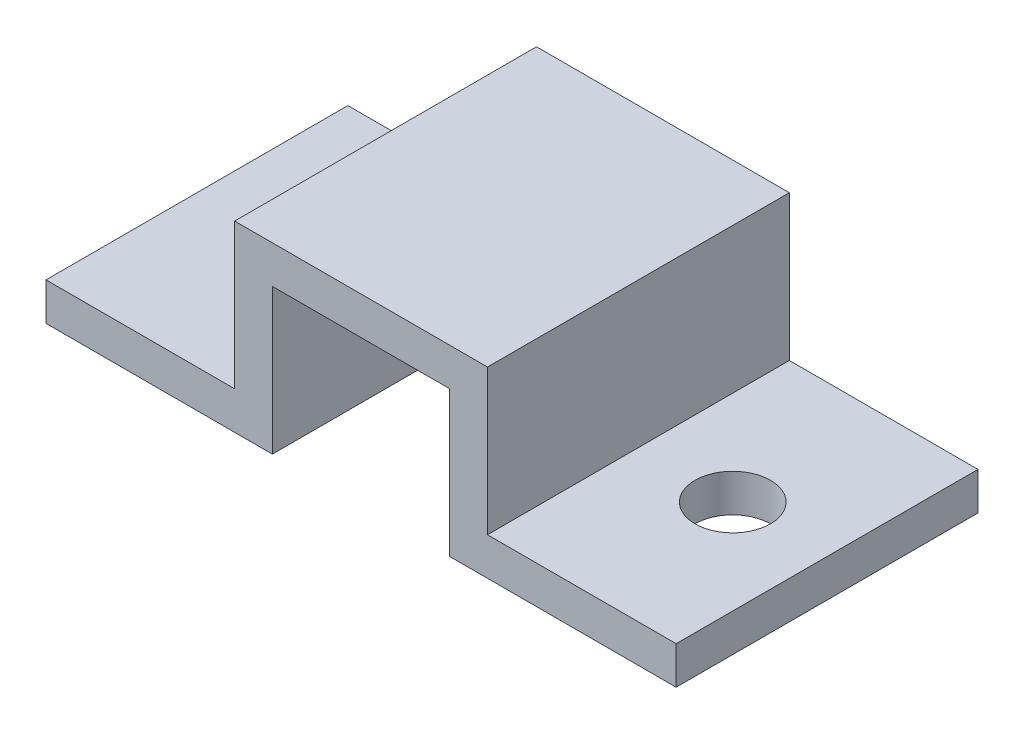
ISO-10303-21;
HEADER;
FILE_DESCRIPTION(('STEP AP214'),'2;1');
FILE_NAME('part.step','',(''),(''),'','','');
FILE_SCHEMA(('AUTOMOTIVE_DESIGN { 1 0 10303 214 1 1 1 1 }'));
ENDSEC;
DATA;
#1=APPLICATION_CONTEXT('core data for automotive mechanical design processes');
#2=APPLICATION_PROTOCOL_DEFINITION('international standard','automotive_design',2000,#1);
#3=PRODUCT_CONTEXT('',#1,'mechanical');
#4=PRODUCT('Part','Part','',(#3));
#5=PRODUCT_RELATED_PRODUCT_CATEGORY('part','',(#4));
#6=PRODUCT_DEFINITION_FORMATION('','',#4);
#7=PRODUCT_DEFINITION_CONTEXT('part definition',#1,'design');
#8=PRODUCT_DEFINITION('design','',#6,#7);
#9=PRODUCT_DEFINITION_SHAPE('','',#8);
#10=(LENGTH_UNIT() NAMED_UNIT(*) SI_UNIT(.MILLI.,.METRE.));
#11=(NAMED_UNIT(*) PLANE_ANGLE_UNIT() SI_UNIT($,.RADIAN.));
#12=(NAMED_UNIT(*) SI_UNIT($,.STERADIAN.) SOLID_ANGLE_UNIT());
#13=UNCERTAINTY_MEASURE_WITH_UNIT(LENGTH_MEASURE(1.E-05),#10,'distance_accuracy_value','');
#14=(GEOMETRIC_REPRESENTATION_CONTEXT(3) GLOBAL_UNCERTAINTY_ASSIGNED_CONTEXT((#13)) GLOBAL_UNIT_ASSIGNED_CONTEXT((#10,
#11,#12)) REPRESENTATION_CONTEXT('',''));
#15=CARTESIAN_POINT('',(0.,0.,0.));
#16=DIRECTION('',(0.,0.,1.));
#17=DIRECTION('',(1.,0.,0.));
#18=AXIS2_PLACEMENT_3D('',#15,#16,#17);
#19=CARTESIAN_POINT('',(0.,0.,0.));
#20=DIRECTION('',(0.,1.,0.));
#21=DIRECTION('',(0.,0.,1.));
#22=AXIS2_PLACEMENT_3D('',#19,#20,#21);
#23=PLANE('',#22);
#24=CARTESIAN_POINT('',(0.751403741010152,0.,5.35824293734881));
#25=DIRECTION('',(0.,1.,0.));
#26=DIRECTION('',(0.,0.,1.));
#27=AXIS2_PLACEMENT_3D('',#24,#25,#26);
#28=CIRCLE('',#27,2.54);
#29=CARTESIAN_POINT('',(0.751403741010152,0.,7.89824293734881));
#30=VERTEX_POINT('',#29);
#31=EDGE_CURVE('E150',#30,#30,#28,.T.);
#32=ORIENTED_EDGE('',*,*,#31,.T.);
#33=EDGE_LOOP('',(#32));
#34=FACE_BOUND('',#33,.T.);
#35=DIRECTION('',(-1.,0.,0.));
#36=VECTOR('',#35,1.);
#37=CARTESIAN_POINT('',(-5.59859625898985,0.,-4.80175706265119));
#38=LINE('',#37,#36);
#39=CARTESIAN_POINT('',(9.64140374101015,0.,-4.80175706265119));
#40=VERTEX_POINT('',#39);
#41=CARTESIAN_POINT('',(-5.59859625898985,0.,-4.80175706265119));
#42=VERTEX_POINT('',#41);
#43=EDGE_CURVE('E209',#40,#42,#38,.T.);
#44=ORIENTED_EDGE('',*,*,#43,.F.);
#45=DIRECTION('',(0.,0.,-1.));
#46=VECTOR('',#45,1.);
#47=CARTESIAN_POINT('',(9.64140374101015,0.,15.5182429373488));
#48=LINE('',#47,#46);
#49=CARTESIAN_POINT('',(9.64140374101015,0.,15.5182429373488));
#50=VERTEX_POINT('',#49);
#51=EDGE_CURVE('E126',#50,#40,#48,.T.);
#52=ORIENTED_EDGE('',*,*,#51,.F.);
#53=DIRECTION('',(1.,0.,0.));
#54=VECTOR('',#53,1.);
#55=CARTESIAN_POINT('',(-5.59859625898985,0.,15.5182429373488));
#56=LINE('',#55,#54);
#57=CARTESIAN_POINT('',(-5.59859625898985,0.,15.5182429373488));
#58=VERTEX_POINT('',#57);
#59=EDGE_CURVE('E203',#58,#50,#56,.T.);
#60=ORIENTED_EDGE('',*,*,#59,.F.);
#61=DIRECTION('',(0.,0.,1.));
#62=VECTOR('',#61,1.);
#63=CARTESIAN_POINT('',(-5.59859625898985,0.,-4.80175706265119));
#64=LINE('',#63,#62);
#65=EDGE_CURVE('E191',#42,#58,#64,.T.);
#66=ORIENTED_EDGE('',*,*,#65,.F.);
#67=EDGE_LOOP('',(#44,#52,#60,#66));
#68=FACE_BOUND('',#67,.T.);
#69=ADVANCED_FACE('F33',(#34,#68),#23,.F.);
#70=CARTESIAN_POINT('',(36.8194037410101,12.319,-4.80175706265119));
#71=DIRECTION('',(-1.,0.,0.));
#72=DIRECTION('',(0.,0.,1.));
#73=AXIS2_PLACEMENT_3D('',#70,#71,#72);
#74=PLANE('',#73);
#75=DIRECTION('',(0.,0.,-1.));
#76=VECTOR('',#75,1.);
#77=CARTESIAN_POINT('',(36.8194037410101,2.54,15.5182429373488));
#78=LINE('',#77,#76);
#79=CARTESIAN_POINT('',(36.8194037410101,2.54,15.5182429373488));
#80=VERTEX_POINT('',#79);
#81=CARTESIAN_POINT('',(36.8194037410101,2.54,-4.80175706265119));
#82=VERTEX_POINT('',#81);
#83=EDGE_CURVE('E159',#80,#82,#78,.T.);
#84=ORIENTED_EDGE('',*,*,#83,.F.);
#85=DIRECTION('',(0.,-1.,0.));
#86=VECTOR('',#85,1.);
#87=CARTESIAN_POINT('',(36.8194037410101,12.319,15.5182429373488));
#88=LINE('',#87,#86);
#89=CARTESIAN_POINT('',(36.8194037410101,0.,15.5182429373488));
#90=VERTEX_POINT('',#89);
#91=EDGE_CURVE('E41',#80,#90,#88,.T.);
#92=ORIENTED_EDGE('',*,*,#91,.T.);
#93=DIRECTION('',(0.,0.,-1.));
#94=VECTOR('',#93,1.);
#95=CARTESIAN_POINT('',(36.8194037410101,0.,-4.80175706265119));
#96=LINE('',#95,#94);
#97=CARTESIAN_POINT('',(36.8194037410101,0.,-4.80175706265119));
#98=VERTEX_POINT('',#97);
#99=EDGE_CURVE('E206',#90,#98,#96,.T.);
#100=ORIENTED_EDGE('',*,*,#99,.T.);
#101=DIRECTION('',(0.,-1.,0.));
#102=VECTOR('',#101,1.);
#103=CARTESIAN_POINT('',(36.8194037410101,12.319,-4.80175706265119));
#104=LINE('',#103,#102);
#105=EDGE_CURVE('E213',#82,#98,#104,.T.);
#106=ORIENTED_EDGE('',*,*,#105,.F.);
#107=EDGE_LOOP('',(#84,#92,#100,#106));
#108=FACE_BOUND('',#107,.T.);
#109=ADVANCED_FACE('F219',(#108),#74,.F.);
#110=CARTESIAN_POINT('',(-5.59859625898985,12.319,-4.80175706265119));
#111=DIRECTION('',(1.,0.,0.));
#112=DIRECTION('',(0.,0.,-1.));
#113=AXIS2_PLACEMENT_3D('',#110,#111,#112);
#114=PLANE('',#113);
#115=DIRECTION('',(0.,0.,1.));
#116=VECTOR('',#115,1.);
#117=CARTESIAN_POINT('',(-5.59859625898985,2.54,-4.80175706265119));
#118=LINE('',#117,#116);
#119=CARTESIAN_POINT('',(-5.59859625898985,2.54,-4.80175706265119));
#120=VERTEX_POINT('',#119);
#121=CARTESIAN_POINT('',(-5.59859625898985,2.54,15.5182429373488));
#122=VERTEX_POINT('',#121);
#123=EDGE_CURVE('E175',#120,#122,#118,.T.);
#124=ORIENTED_EDGE('',*,*,#123,.F.);
#125=DIRECTION('',(0.,-1.,0.));
#126=VECTOR('',#125,1.);
#127=CARTESIAN_POINT('',(-5.59859625898985,12.319,-4.80175706265119));
#128=LINE('',#127,#126);
#129=EDGE_CURVE('E199',#120,#42,#128,.T.);
#130=ORIENTED_EDGE('',*,*,#129,.T.);
#131=ORIENTED_EDGE('',*,*,#65,.T.);
#132=DIRECTION('',(0.,-1.,0.));
#133=VECTOR('',#132,1.);
#134=CARTESIAN_POINT('',(-5.59859625898985,12.319,15.5182429373488));
#135=LINE('',#134,#133);
#136=EDGE_CURVE('E11',#122,#58,#135,.T.);
#137=ORIENTED_EDGE('',*,*,#136,.F.);
#138=EDGE_LOOP('',(#124,#130,#131,#137));
#139=FACE_BOUND('',#138,.T.);
#140=ADVANCED_FACE('F35',(#139),#114,.F.);
#141=CARTESIAN_POINT('',(-5.59859625898985,12.319,15.5182429373488));
#142=DIRECTION('',(0.,0.,-1.));
#143=DIRECTION('',(-1.,0.,0.));
#144=AXIS2_PLACEMENT_3D('',#141,#142,#143);
#145=PLANE('',#144);
#146=ORIENTED_EDGE('',*,*,#59,.T.);
#147=DIRECTION('',(0.,-1.,0.));
#148=VECTOR('',#147,1.);
#149=CARTESIAN_POINT('',(9.64140374101015,9.779,15.5182429373488));
#150=LINE('',#149,#148);
#151=CARTESIAN_POINT('',(9.64140374101015,9.779,15.5182429373488));
#152=VERTEX_POINT('',#151);
#153=EDGE_CURVE('E152',#152,#50,#150,.T.);
#154=ORIENTED_EDGE('',*,*,#153,.F.);
#155=DIRECTION('',(-1.,0.,0.));
#156=VECTOR('',#155,1.);
#157=CARTESIAN_POINT('',(9.64140374101015,9.779,15.5182429373488));
#158=LINE('',#157,#156);
#159=CARTESIAN_POINT('',(21.5794037410102,9.779,15.5182429373488));
#160=VERTEX_POINT('',#159);
#161=EDGE_CURVE('E130',#160,#152,#158,.T.);
#162=ORIENTED_EDGE('',*,*,#161,.F.);
#163=DIRECTION('',(0.,-1.,0.));
#164=VECTOR('',#163,1.);
#165=CARTESIAN_POINT('',(21.5794037410102,9.779,15.5182429373488));
#166=LINE('',#165,#164);
#167=CARTESIAN_POINT('',(21.5794037410102,0.,15.5182429373488));
#168=VERTEX_POINT('',#167);
#169=EDGE_CURVE('E155',#160,#168,#166,.T.);
#170=ORIENTED_EDGE('',*,*,#169,.T.);
#171=EDGE_CURVE('E202',#168,#90,#56,.T.);
#172=ORIENTED_EDGE('',*,*,#171,.T.);
#173=ORIENTED_EDGE('',*,*,#91,.F.);
#174=DIRECTION('',(1.,0.,0.));
#175=VECTOR('',#174,1.);
#176=CARTESIAN_POINT('',(36.8194037410101,2.54,15.5182429373488));
#177=LINE('',#176,#175);
#178=CARTESIAN_POINT('',(24.1194037410101,2.54,15.5182429373488));
#179=VERTEX_POINT('',#178);
#180=EDGE_CURVE('E167',#179,#80,#177,.T.);
#181=ORIENTED_EDGE('',*,*,#180,.F.);
#182=DIRECTION('',(0.,1.,0.));
#183=VECTOR('',#182,1.);
#184=CARTESIAN_POINT('',(24.1194037410101,2.54,15.5182429373488));
#185=LINE('',#184,#183);
#186=CARTESIAN_POINT('',(24.1194037410101,12.319,15.5182429373488));
#187=VERTEX_POINT('',#186);
#188=EDGE_CURVE('E170',#179,#187,#185,.T.);
#189=ORIENTED_EDGE('',*,*,#188,.T.);
#190=DIRECTION('',(1.,0.,0.));
#191=VECTOR('',#190,1.);
#192=CARTESIAN_POINT('',(-5.59859625898985,12.319,15.5182429373488));
#193=LINE('',#192,#191);
#194=CARTESIAN_POINT('',(7.10140374101015,12.319,15.5182429373488));
#195=VERTEX_POINT('',#194);
#196=EDGE_CURVE('E193',#195,#187,#193,.T.);
#197=ORIENTED_EDGE('',*,*,#196,.F.);
#198=DIRECTION('',(0.,1.,0.));
#199=VECTOR('',#198,1.);
#200=CARTESIAN_POINT('',(7.10140374101015,2.54,15.5182429373488));
#201=LINE('',#200,#199);
#202=CARTESIAN_POINT('',(7.10140374101015,2.54,15.5182429373488));
#203=VERTEX_POINT('',#202);
#204=EDGE_CURVE('E185',#203,#195,#201,.T.);
#205=ORIENTED_EDGE('',*,*,#204,.F.);
#206=DIRECTION('',(1.,0.,0.));
#207=VECTOR('',#206,1.);
#208=CARTESIAN_POINT('',(-5.59859625898985,2.54,15.5182429373488));
#209=LINE('',#208,#207);
#210=EDGE_CURVE('E177',#122,#203,#209,.T.);
#211=ORIENTED_EDGE('',*,*,#210,.F.);
#212=ORIENTED_EDGE('',*,*,#136,.T.);
#213=EDGE_LOOP('',(#146,#154,#162,#170,#172,#173,#181,#189,#197,#205,#211,#212));
#214=FACE_BOUND('',#213,.T.);
#215=ADVANCED_FACE('F231',(#214),#145,.F.);
#216=CARTESIAN_POINT('',(-5.59859625898985,12.319,-4.80175706265119));
#217=DIRECTION('',(0.,0.,1.));
#218=DIRECTION('',(1.,0.,0.));
#219=AXIS2_PLACEMENT_3D('',#216,#217,#218);
#220=PLANE('',#219);
#221=DIRECTION('',(1.,0.,0.));
#222=VECTOR('',#221,1.);
#223=CARTESIAN_POINT('',(9.64140374101015,9.779,-4.80175706265119));
#224=LINE('',#223,#222);
#225=CARTESIAN_POINT('',(9.64140374101015,9.779,-4.80175706265119));
#226=VERTEX_POINT('',#225);
#227=CARTESIAN_POINT('',(21.5794037410102,9.779,-4.80175706265119));
#228=VERTEX_POINT('',#227);
#229=EDGE_CURVE('E136',#226,#228,#224,.T.);
#230=ORIENTED_EDGE('',*,*,#229,.F.);
#231=DIRECTION('',(0.,-1.,0.));
#232=VECTOR('',#231,1.);
#233=CARTESIAN_POINT('',(9.64140374101015,9.779,-4.80175706265119));
#234=LINE('',#233,#232);
#235=EDGE_CURVE('E120',#226,#40,#234,.T.);
#236=ORIENTED_EDGE('',*,*,#235,.T.);
#237=ORIENTED_EDGE('',*,*,#43,.T.);
#238=ORIENTED_EDGE('',*,*,#129,.F.);
#239=DIRECTION('',(-1.,0.,0.));
#240=VECTOR('',#239,1.);
#241=CARTESIAN_POINT('',(-5.59859625898985,2.54,-4.80175706265119));
#242=LINE('',#241,#240);
#243=CARTESIAN_POINT('',(7.10140374101015,2.54,-4.80175706265119));
#244=VERTEX_POINT('',#243);
#245=EDGE_CURVE('E183',#244,#120,#242,.T.);
#246=ORIENTED_EDGE('',*,*,#245,.F.);
#247=DIRECTION('',(0.,1.,0.));
#248=VECTOR('',#247,1.);
#249=CARTESIAN_POINT('',(7.10140374101015,2.54,-4.80175706265119));
#250=LINE('',#249,#248);
#251=CARTESIAN_POINT('',(7.10140374101015,12.319,-4.80175706265119));
#252=VERTEX_POINT('',#251);
#253=EDGE_CURVE('E188',#244,#252,#250,.T.);
#254=ORIENTED_EDGE('',*,*,#253,.T.);
#255=DIRECTION('',(-1.,0.,0.));
#256=VECTOR('',#255,1.);
#257=CARTESIAN_POINT('',(-5.59859625898985,12.319,-4.80175706265119));
#258=LINE('',#257,#256);
#259=CARTESIAN_POINT('',(24.1194037410101,12.319,-4.80175706265119));
#260=VERTEX_POINT('',#259);
#261=EDGE_CURVE('E196',#260,#252,#258,.T.);
#262=ORIENTED_EDGE('',*,*,#261,.F.);
#263=DIRECTION('',(0.,1.,0.));
#264=VECTOR('',#263,1.);
#265=CARTESIAN_POINT('',(24.1194037410101,2.54,-4.80175706265119));
#266=LINE('',#265,#264);
#267=CARTESIAN_POINT('',(24.1194037410101,2.54,-4.80175706265119));
#268=VERTEX_POINT('',#267);
#269=EDGE_CURVE('E56',#268,#260,#266,.T.);
#270=ORIENTED_EDGE('',*,*,#269,.F.);
#271=DIRECTION('',(-1.,0.,0.));
#272=VECTOR('',#271,1.);
#273=CARTESIAN_POINT('',(36.8194037410101,2.54,-4.80175706265119));
#274=LINE('',#273,#272);
#275=EDGE_CURVE('E161',#82,#268,#274,.T.);
#276=ORIENTED_EDGE('',*,*,#275,.F.);
#277=ORIENTED_EDGE('',*,*,#105,.T.);
#278=CARTESIAN_POINT('',(21.5794037410102,0.,-4.80175706265119));
#279=VERTEX_POINT('',#278);
#280=EDGE_CURVE('E197',#98,#279,#38,.T.);
#281=ORIENTED_EDGE('',*,*,#280,.T.);
#282=DIRECTION('',(0.,-1.,0.));
#283=VECTOR('',#282,1.);
#284=CARTESIAN_POINT('',(21.5794037410102,9.779,-4.80175706265119));
#285=LINE('',#284,#283);
#286=EDGE_CURVE('E48',#228,#279,#285,.T.);
#287=ORIENTED_EDGE('',*,*,#286,.F.);
#288=EDGE_LOOP('',(#230,#236,#237,#238,#246,#254,#262,#270,#276,#277,#281,#287));
#289=FACE_BOUND('',#288,.T.);
#290=ADVANCED_FACE('F141',(#289),#220,.F.);
#291=CARTESIAN_POINT('',(0.,12.319,0.));
#292=DIRECTION('',(0.,1.,0.));
#293=DIRECTION('',(0.,0.,1.));
#294=AXIS2_PLACEMENT_3D('',#291,#292,#293);
#295=PLANE('',#294);
#296=DIRECTION('',(0.,0.,1.));
#297=VECTOR('',#296,1.);
#298=CARTESIAN_POINT('',(24.1194037410101,12.319,15.5182429373488));
#299=LINE('',#298,#297);
#300=EDGE_CURVE('E154',#260,#187,#299,.T.);
#301=ORIENTED_EDGE('',*,*,#300,.F.);
#302=ORIENTED_EDGE('',*,*,#261,.T.);
#303=DIRECTION('',(0.,0.,-1.));
#304=VECTOR('',#303,1.);
#305=CARTESIAN_POINT('',(7.10140374101015,12.319,-4.80175706265119));
#306=LINE('',#305,#304);
#307=EDGE_CURVE('E173',#195,#252,#306,.T.);
#308=ORIENTED_EDGE('',*,*,#307,.F.);
#309=ORIENTED_EDGE('',*,*,#196,.T.);
#310=EDGE_LOOP('',(#301,#302,#308,#309));
#311=FACE_BOUND('',#310,.T.);
#312=ADVANCED_FACE('F236',(#311),#295,.T.);
#313=CARTESIAN_POINT('',(30.4694037410101,0.,5.35824293734881));
#314=DIRECTION('',(0.,1.,0.));
#315=DIRECTION('',(0.,0.,1.));
#316=AXIS2_PLACEMENT_3D('',#313,#314,#315);
#317=CIRCLE('',#316,2.54);
#318=CARTESIAN_POINT('',(30.4694037410101,0.,7.89824293734881));
#319=VERTEX_POINT('',#318);
#320=EDGE_CURVE('E271',#319,#319,#317,.T.);
#321=ORIENTED_EDGE('',*,*,#320,.T.);
#322=EDGE_LOOP('',(#321));
#323=FACE_BOUND('',#322,.T.);
#324=ORIENTED_EDGE('',*,*,#171,.F.);
#325=DIRECTION('',(0.,0.,1.));
#326=VECTOR('',#325,1.);
#327=CARTESIAN_POINT('',(21.5794037410102,0.,15.5182429373488));
#328=LINE('',#327,#326);
#329=EDGE_CURVE('E139',#279,#168,#328,.T.);
#330=ORIENTED_EDGE('',*,*,#329,.F.);
#331=ORIENTED_EDGE('',*,*,#280,.F.);
#332=ORIENTED_EDGE('',*,*,#99,.F.);
#333=EDGE_LOOP('',(#324,#330,#331,#332));
#334=FACE_BOUND('',#333,.T.);
#335=ADVANCED_FACE('F226',(#323,#334),#23,.F.);
#336=CARTESIAN_POINT('',(7.10140374101015,2.54,-4.80175706265119));
#337=DIRECTION('',(1.,0.,0.));
#338=DIRECTION('',(0.,0.,-1.));
#339=AXIS2_PLACEMENT_3D('',#336,#337,#338);
#340=PLANE('',#339);
#341=ORIENTED_EDGE('',*,*,#307,.T.);
#342=ORIENTED_EDGE('',*,*,#253,.F.);
#343=DIRECTION('',(0.,0.,-1.));
#344=VECTOR('',#343,1.);
#345=CARTESIAN_POINT('',(7.10140374101015,2.54,-4.80175706265119));
#346=LINE('',#345,#344);
#347=EDGE_CURVE('E180',#203,#244,#346,.T.);
#348=ORIENTED_EDGE('',*,*,#347,.F.);
#349=ORIENTED_EDGE('',*,*,#204,.T.);
#350=EDGE_LOOP('',(#341,#342,#348,#349));
#351=FACE_BOUND('',#350,.T.);
#352=ADVANCED_FACE('F238',(#351),#340,.F.);
#353=CARTESIAN_POINT('',(0.,2.54,0.));
#354=DIRECTION('',(0.,1.,0.));
#355=DIRECTION('',(0.,0.,1.));
#356=AXIS2_PLACEMENT_3D('',#353,#354,#355);
#357=PLANE('',#356);
#358=CARTESIAN_POINT('',(0.751403741010152,2.54,5.35824293734881));
#359=DIRECTION('',(0.,1.,0.));
#360=DIRECTION('',(0.,0.,1.));
#361=AXIS2_PLACEMENT_3D('',#358,#359,#360);
#362=CIRCLE('',#361,2.54);
#363=CARTESIAN_POINT('',(0.751403741010152,2.54,7.89824293734881));
#364=VERTEX_POINT('',#363);
#365=EDGE_CURVE('E273',#364,#364,#362,.T.);
#366=ORIENTED_EDGE('',*,*,#365,.F.);
#367=EDGE_LOOP('',(#366));
#368=FACE_BOUND('',#367,.T.);
#369=ORIENTED_EDGE('',*,*,#123,.T.);
#370=ORIENTED_EDGE('',*,*,#210,.T.);
#371=ORIENTED_EDGE('',*,*,#347,.T.);
#372=ORIENTED_EDGE('',*,*,#245,.T.);
#373=EDGE_LOOP('',(#369,#370,#371,#372));
#374=FACE_BOUND('',#373,.T.);
#375=ADVANCED_FACE('F243',(#368,#374),#357,.T.);
#376=CARTESIAN_POINT('',(24.1194037410101,2.54,15.5182429373488));
#377=DIRECTION('',(-1.,0.,0.));
#378=DIRECTION('',(0.,0.,1.));
#379=AXIS2_PLACEMENT_3D('',#376,#377,#378);
#380=PLANE('',#379);
#381=ORIENTED_EDGE('',*,*,#300,.T.);
#382=ORIENTED_EDGE('',*,*,#188,.F.);
#383=DIRECTION('',(0.,0.,1.));
#384=VECTOR('',#383,1.);
#385=CARTESIAN_POINT('',(24.1194037410101,2.54,15.5182429373488));
#386=LINE('',#385,#384);
#387=EDGE_CURVE('E164',#268,#179,#386,.T.);
#388=ORIENTED_EDGE('',*,*,#387,.F.);
#389=ORIENTED_EDGE('',*,*,#269,.T.);
#390=EDGE_LOOP('',(#381,#382,#388,#389));
#391=FACE_BOUND('',#390,.T.);
#392=ADVANCED_FACE('F290',(#391),#380,.F.);
#393=CARTESIAN_POINT('',(0.,2.54,0.));
#394=DIRECTION('',(0.,1.,0.));
#395=DIRECTION('',(0.,0.,1.));
#396=AXIS2_PLACEMENT_3D('',#393,#394,#395);
#397=PLANE('',#396);
#398=CARTESIAN_POINT('',(30.4694037410101,2.54,5.35824293734881));
#399=DIRECTION('',(0.,1.,0.));
#400=DIRECTION('',(0.,0.,1.));
#401=AXIS2_PLACEMENT_3D('',#398,#399,#400);
#402=CIRCLE('',#401,2.54);
#403=CARTESIAN_POINT('',(30.4694037410101,2.54,7.89824293734881));
#404=VERTEX_POINT('',#403);
#405=EDGE_CURVE('E274',#404,#404,#402,.T.);
#406=ORIENTED_EDGE('',*,*,#405,.F.);
#407=EDGE_LOOP('',(#406));
#408=FACE_BOUND('',#407,.T.);
#409=ORIENTED_EDGE('',*,*,#83,.T.);
#410=ORIENTED_EDGE('',*,*,#275,.T.);
#411=ORIENTED_EDGE('',*,*,#387,.T.);
#412=ORIENTED_EDGE('',*,*,#180,.T.);
#413=EDGE_LOOP('',(#409,#410,#411,#412));
#414=FACE_BOUND('',#413,.T.);
#415=ADVANCED_FACE('F230',(#408,#414),#397,.T.);
#416=CARTESIAN_POINT('',(9.64140374101015,9.779,15.5182429373488));
#417=DIRECTION('',(-1.,0.,0.));
#418=DIRECTION('',(0.,0.,1.));
#419=AXIS2_PLACEMENT_3D('',#416,#417,#418);
#420=PLANE('',#419);
#421=ORIENTED_EDGE('',*,*,#51,.T.);
#422=ORIENTED_EDGE('',*,*,#235,.F.);
#423=DIRECTION('',(0.,0.,-1.));
#424=VECTOR('',#423,1.);
#425=CARTESIAN_POINT('',(9.64140374101015,9.779,15.5182429373488));
#426=LINE('',#425,#424);
#427=EDGE_CURVE('E123',#152,#226,#426,.T.);
#428=ORIENTED_EDGE('',*,*,#427,.F.);
#429=ORIENTED_EDGE('',*,*,#153,.T.);
#430=EDGE_LOOP('',(#421,#422,#428,#429));
#431=FACE_BOUND('',#430,.T.);
#432=ADVANCED_FACE('F122',(#431),#420,.F.);
#433=CARTESIAN_POINT('',(21.5794037410102,9.779,15.5182429373488));
#434=DIRECTION('',(1.,0.,0.));
#435=DIRECTION('',(0.,0.,-1.));
#436=AXIS2_PLACEMENT_3D('',#433,#434,#435);
#437=PLANE('',#436);
#438=ORIENTED_EDGE('',*,*,#329,.T.);
#439=ORIENTED_EDGE('',*,*,#169,.F.);
#440=DIRECTION('',(0.,0.,1.));
#441=VECTOR('',#440,1.);
#442=CARTESIAN_POINT('',(21.5794037410102,9.779,15.5182429373488));
#443=LINE('',#442,#441);
#444=EDGE_CURVE('E143',#228,#160,#443,.T.);
#445=ORIENTED_EDGE('',*,*,#444,.F.);
#446=ORIENTED_EDGE('',*,*,#286,.T.);
#447=EDGE_LOOP('',(#438,#439,#445,#446));
#448=FACE_BOUND('',#447,.T.);
#449=ADVANCED_FACE('F301',(#448),#437,.F.);
#450=CARTESIAN_POINT('',(0.,9.779,0.));
#451=DIRECTION('',(0.,-1.,0.));
#452=DIRECTION('',(0.,0.,-1.));
#453=AXIS2_PLACEMENT_3D('',#450,#451,#452);
#454=PLANE('',#453);
#455=ORIENTED_EDGE('',*,*,#427,.T.);
#456=ORIENTED_EDGE('',*,*,#229,.T.);
#457=ORIENTED_EDGE('',*,*,#444,.T.);
#458=ORIENTED_EDGE('',*,*,#161,.T.);
#459=EDGE_LOOP('',(#455,#456,#457,#458));
#460=FACE_BOUND('',#459,.T.);
#461=ADVANCED_FACE('F134',(#460),#454,.T.);
#462=CARTESIAN_POINT('',(0.751403741010152,0.,5.35824293734881));
#463=DIRECTION('',(0.,1.,0.));
#464=DIRECTION('',(0.,0.,1.));
#465=AXIS2_PLACEMENT_3D('',#462,#463,#464);
#466=CYLINDRICAL_SURFACE('',#465,2.54);
#467=ORIENTED_EDGE('',*,*,#31,.F.);
#468=EDGE_LOOP('',(#467));
#469=FACE_BOUND('',#468,.T.);
#470=ORIENTED_EDGE('',*,*,#365,.T.);
#471=EDGE_LOOP('',(#470));
#472=FACE_BOUND('',#471,.T.);
#473=ADVANCED_FACE('F282',(#469,#472),#466,.F.);
#474=CARTESIAN_POINT('',(30.4694037410101,0.,5.35824293734881));
#475=DIRECTION('',(0.,1.,0.));
#476=DIRECTION('',(0.,0.,1.));
#477=AXIS2_PLACEMENT_3D('',#474,#475,#476);
#478=CYLINDRICAL_SURFACE('',#477,2.54);
#479=ORIENTED_EDGE('',*,*,#320,.F.);
#480=EDGE_LOOP('',(#479));
#481=FACE_BOUND('',#480,.T.);
#482=ORIENTED_EDGE('',*,*,#405,.T.);
#483=EDGE_LOOP('',(#482));
#484=FACE_BOUND('',#483,.T.);
#485=ADVANCED_FACE('F285',(#481,#484),#478,.F.);
#486=CLOSED_SHELL('',(#69,#109,#140,#215,#290,#312,#335,#352,#375,#392,#415,#432,#449,#461,#473,#485));
#487=MANIFOLD_SOLID_BREP('B2',#486);
#488=ADVANCED_BREP_SHAPE_REPRESENTATION('',(#18,#487),#14);
#489=SHAPE_DEFINITION_REPRESENTATION(#9,#488);
ENDSEC;
END-ISO-10303-21;
